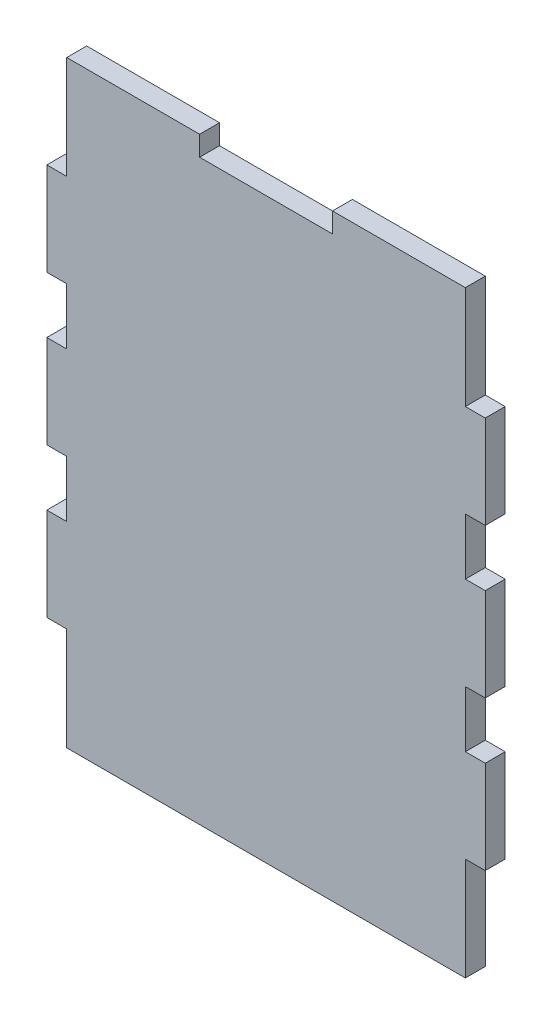
ISO-10303-21;
HEADER;
FILE_DESCRIPTION(('STEP AP214'),'2;1');
FILE_NAME('part.step','',(''),(''),'','','');
FILE_SCHEMA(('AUTOMOTIVE_DESIGN { 1 0 10303 214 1 1 1 1 }'));
ENDSEC;
DATA;
#1=APPLICATION_CONTEXT('core data for automotive mechanical design processes');
#2=APPLICATION_PROTOCOL_DEFINITION('international standard','automotive_design',2000,#1);
#3=PRODUCT_CONTEXT('',#1,'mechanical');
#4=PRODUCT('Part','Part','',(#3));
#5=PRODUCT_RELATED_PRODUCT_CATEGORY('part','',(#4));
#6=PRODUCT_DEFINITION_FORMATION('','',#4);
#7=PRODUCT_DEFINITION_CONTEXT('part definition',#1,'design');
#8=PRODUCT_DEFINITION('design','',#6,#7);
#9=PRODUCT_DEFINITION_SHAPE('','',#8);
#10=(LENGTH_UNIT() NAMED_UNIT(*) SI_UNIT(.MILLI.,.METRE.));
#11=(NAMED_UNIT(*) PLANE_ANGLE_UNIT() SI_UNIT($,.RADIAN.));
#12=(NAMED_UNIT(*) SI_UNIT($,.STERADIAN.) SOLID_ANGLE_UNIT());
#13=UNCERTAINTY_MEASURE_WITH_UNIT(LENGTH_MEASURE(1.E-05),#10,'distance_accuracy_value','');
#14=(GEOMETRIC_REPRESENTATION_CONTEXT(3) GLOBAL_UNCERTAINTY_ASSIGNED_CONTEXT((#13)) GLOBAL_UNIT_ASSIGNED_CONTEXT((#10,
#11,#12)) REPRESENTATION_CONTEXT('',''));
#15=CARTESIAN_POINT('',(0.,0.,0.));
#16=DIRECTION('',(0.,0.,1.));
#17=DIRECTION('',(1.,0.,0.));
#18=AXIS2_PLACEMENT_3D('',#15,#16,#17);
#19=CARTESIAN_POINT('',(0.,45.,3.));
#20=DIRECTION('',(0.,-1.,0.));
#21=DIRECTION('',(0.,0.,-1.));
#22=AXIS2_PLACEMENT_3D('',#19,#20,#21);
#23=PLANE('',#22);
#24=DIRECTION('',(-1.,0.,0.));
#25=VECTOR('',#24,1.);
#26=CARTESIAN_POINT('',(0.,45.,3.));
#27=LINE('',#26,#25);
#28=CARTESIAN_POINT('',(-10.,45.,3.));
#29=VERTEX_POINT('',#28);
#30=CARTESIAN_POINT('',(-30.,45.,3.));
#31=VERTEX_POINT('',#30);
#32=EDGE_CURVE('E1211',#29,#31,#27,.T.);
#33=ORIENTED_EDGE('',*,*,#32,.F.);
#34=DIRECTION('',(0.,0.,-1.));
#35=VECTOR('',#34,1.);
#36=CARTESIAN_POINT('',(-10.,45.,3.));
#37=LINE('',#36,#35);
#38=CARTESIAN_POINT('',(-10.,45.,0.));
#39=VERTEX_POINT('',#38);
#40=EDGE_CURVE('E1217',#29,#39,#37,.T.);
#41=ORIENTED_EDGE('',*,*,#40,.T.);
#42=DIRECTION('',(-1.,0.,0.));
#43=VECTOR('',#42,1.);
#44=CARTESIAN_POINT('',(0.,45.,0.));
#45=LINE('',#44,#43);
#46=CARTESIAN_POINT('',(-30.,45.,0.));
#47=VERTEX_POINT('',#46);
#48=EDGE_CURVE('E1196',#39,#47,#45,.T.);
#49=ORIENTED_EDGE('',*,*,#48,.T.);
#50=DIRECTION('',(0.,0.,-1.));
#51=VECTOR('',#50,1.);
#52=CARTESIAN_POINT('',(-30.,45.,3.));
#53=LINE('',#52,#51);
#54=EDGE_CURVE('E1156',#31,#47,#53,.T.);
#55=ORIENTED_EDGE('',*,*,#54,.F.);
#56=EDGE_LOOP('',(#33,#41,#49,#55));
#57=FACE_BOUND('',#56,.T.);
#58=ADVANCED_FACE('F851',(#57),#23,.F.);
#59=CARTESIAN_POINT('',(-30.,0.,3.));
#60=DIRECTION('',(-1.,0.,0.));
#61=DIRECTION('',(0.,0.,1.));
#62=AXIS2_PLACEMENT_3D('',#59,#60,#61);
#63=PLANE('',#62);
#64=DIRECTION('',(0.,1.,0.));
#65=VECTOR('',#64,1.);
#66=CARTESIAN_POINT('',(-30.,0.,0.));
#67=LINE('',#66,#65);
#68=CARTESIAN_POINT('',(-30.,7.,0.));
#69=VERTEX_POINT('',#68);
#70=CARTESIAN_POINT('',(-30.,15.5,0.));
#71=VERTEX_POINT('',#70);
#72=EDGE_CURVE('E1192',#69,#71,#67,.T.);
#73=ORIENTED_EDGE('',*,*,#72,.F.);
#74=DIRECTION('',(0.,0.,-1.));
#75=VECTOR('',#74,1.);
#76=CARTESIAN_POINT('',(-30.,7.,3.));
#77=LINE('',#76,#75);
#78=CARTESIAN_POINT('',(-30.,7.,3.));
#79=VERTEX_POINT('',#78);
#80=EDGE_CURVE('E1163',#79,#69,#77,.T.);
#81=ORIENTED_EDGE('',*,*,#80,.F.);
#82=DIRECTION('',(0.,1.,0.));
#83=VECTOR('',#82,1.);
#84=CARTESIAN_POINT('',(-30.,0.,3.));
#85=LINE('',#84,#83);
#86=CARTESIAN_POINT('',(-30.,15.5,3.));
#87=VERTEX_POINT('',#86);
#88=EDGE_CURVE('E1207',#79,#87,#85,.T.);
#89=ORIENTED_EDGE('',*,*,#88,.T.);
#90=DIRECTION('',(0.,0.,-1.));
#91=VECTOR('',#90,1.);
#92=CARTESIAN_POINT('',(-30.,15.5,3.));
#93=LINE('',#92,#91);
#94=EDGE_CURVE('E1161',#87,#71,#93,.T.);
#95=ORIENTED_EDGE('',*,*,#94,.T.);
#96=EDGE_LOOP('',(#73,#81,#89,#95));
#97=FACE_BOUND('',#96,.T.);
#98=ADVANCED_FACE('F1362',(#97),#63,.T.);
#99=CARTESIAN_POINT('',(0.,0.,0.));
#100=DIRECTION('',(0.,0.,1.));
#101=DIRECTION('',(1.,0.,0.));
#102=AXIS2_PLACEMENT_3D('',#99,#100,#101);
#103=PLANE('',#102);
#104=ORIENTED_EDGE('',*,*,#48,.F.);
#105=DIRECTION('',(0.,-1.,0.));
#106=VECTOR('',#105,1.);
#107=CARTESIAN_POINT('',(-10.,0.,0.));
#108=LINE('',#107,#106);
#109=CARTESIAN_POINT('',(-10.,42.,0.));
#110=VERTEX_POINT('',#109);
#111=EDGE_CURVE('E1034',#39,#110,#108,.T.);
#112=ORIENTED_EDGE('',*,*,#111,.T.);
#113=DIRECTION('',(1.,0.,0.));
#114=VECTOR('',#113,1.);
#115=CARTESIAN_POINT('',(0.,42.,0.));
#116=LINE('',#115,#114);
#117=CARTESIAN_POINT('',(9.99999999999999,42.,0.));
#118=VERTEX_POINT('',#117);
#119=EDGE_CURVE('E1226',#110,#118,#116,.T.);
#120=ORIENTED_EDGE('',*,*,#119,.T.);
#121=DIRECTION('',(0.,1.,0.));
#122=VECTOR('',#121,1.);
#123=CARTESIAN_POINT('',(9.99999999999999,0.,0.));
#124=LINE('',#123,#122);
#125=CARTESIAN_POINT('',(9.99999999999999,45.,0.));
#126=VERTEX_POINT('',#125);
#127=EDGE_CURVE('E1220',#118,#126,#124,.T.);
#128=ORIENTED_EDGE('',*,*,#127,.T.);
#129=CARTESIAN_POINT('',(30.,45.,0.));
#130=VERTEX_POINT('',#129);
#131=EDGE_CURVE('E1193',#130,#126,#45,.T.);
#132=ORIENTED_EDGE('',*,*,#131,.F.);
#133=DIRECTION('',(0.,1.,0.));
#134=VECTOR('',#133,1.);
#135=CARTESIAN_POINT('',(30.,0.,0.));
#136=LINE('',#135,#134);
#137=CARTESIAN_POINT('',(30.,29.5,0.));
#138=VERTEX_POINT('',#137);
#139=EDGE_CURVE('E1132',#138,#130,#136,.T.);
#140=ORIENTED_EDGE('',*,*,#139,.F.);
#141=DIRECTION('',(-1.,0.,0.));
#142=VECTOR('',#141,1.);
#143=CARTESIAN_POINT('',(0.,29.5,0.));
#144=LINE('',#143,#142);
#145=CARTESIAN_POINT('',(33.,29.5,0.));
#146=VERTEX_POINT('',#145);
#147=EDGE_CURVE('E1095',#146,#138,#144,.T.);
#148=ORIENTED_EDGE('',*,*,#147,.F.);
#149=DIRECTION('',(0.,1.,0.));
#150=VECTOR('',#149,1.);
#151=CARTESIAN_POINT('',(33.,0.,0.));
#152=LINE('',#151,#150);
#153=CARTESIAN_POINT('',(33.,15.5,0.));
#154=VERTEX_POINT('',#153);
#155=EDGE_CURVE('E1071',#154,#146,#152,.T.);
#156=ORIENTED_EDGE('',*,*,#155,.F.);
#157=DIRECTION('',(-1.,0.,0.));
#158=VECTOR('',#157,1.);
#159=CARTESIAN_POINT('',(0.,15.5,0.));
#160=LINE('',#159,#158);
#161=CARTESIAN_POINT('',(30.,15.5,0.));
#162=VERTEX_POINT('',#161);
#163=EDGE_CURVE('E1091',#154,#162,#160,.T.);
#164=ORIENTED_EDGE('',*,*,#163,.T.);
#165=CARTESIAN_POINT('',(30.,7.,0.));
#166=VERTEX_POINT('',#165);
#167=EDGE_CURVE('E1198',#166,#162,#136,.T.);
#168=ORIENTED_EDGE('',*,*,#167,.F.);
#169=DIRECTION('',(-1.,0.,0.));
#170=VECTOR('',#169,1.);
#171=CARTESIAN_POINT('',(0.,6.99999999999999,0.));
#172=LINE('',#171,#170);
#173=CARTESIAN_POINT('',(33.,7.,0.));
#174=VERTEX_POINT('',#173);
#175=EDGE_CURVE('E1117',#174,#166,#172,.T.);
#176=ORIENTED_EDGE('',*,*,#175,.F.);
#177=DIRECTION('',(0.,1.,0.));
#178=VECTOR('',#177,1.);
#179=CARTESIAN_POINT('',(33.,0.,0.));
#180=LINE('',#179,#178);
#181=CARTESIAN_POINT('',(33.,-7.,0.));
#182=VERTEX_POINT('',#181);
#183=EDGE_CURVE('E1087',#182,#174,#180,.T.);
#184=ORIENTED_EDGE('',*,*,#183,.F.);
#185=DIRECTION('',(-1.,0.,0.));
#186=VECTOR('',#185,1.);
#187=CARTESIAN_POINT('',(0.,-7.00000000000001,0.));
#188=LINE('',#187,#186);
#189=CARTESIAN_POINT('',(30.,-7.,0.));
#190=VERTEX_POINT('',#189);
#191=EDGE_CURVE('E1113',#182,#190,#188,.T.);
#192=ORIENTED_EDGE('',*,*,#191,.T.);
#193=CARTESIAN_POINT('',(30.,-15.5,0.));
#194=VERTEX_POINT('',#193);
#195=EDGE_CURVE('E1312',#194,#190,#136,.T.);
#196=ORIENTED_EDGE('',*,*,#195,.F.);
#197=DIRECTION('',(-1.,0.,0.));
#198=VECTOR('',#197,1.);
#199=CARTESIAN_POINT('',(0.,-15.5,0.));
#200=LINE('',#199,#198);
#201=CARTESIAN_POINT('',(33.,-15.5,0.));
#202=VERTEX_POINT('',#201);
#203=EDGE_CURVE('E1140',#202,#194,#200,.T.);
#204=ORIENTED_EDGE('',*,*,#203,.F.);
#205=DIRECTION('',(0.,1.,0.));
#206=VECTOR('',#205,1.);
#207=CARTESIAN_POINT('',(33.,0.,0.));
#208=LINE('',#207,#206);
#209=CARTESIAN_POINT('',(33.,-29.5,0.));
#210=VERTEX_POINT('',#209);
#211=EDGE_CURVE('E1109',#210,#202,#208,.T.);
#212=ORIENTED_EDGE('',*,*,#211,.F.);
#213=DIRECTION('',(-1.,0.,0.));
#214=VECTOR('',#213,1.);
#215=CARTESIAN_POINT('',(0.,-29.5,0.));
#216=LINE('',#215,#214);
#217=CARTESIAN_POINT('',(30.,-29.5,0.));
#218=VERTEX_POINT('',#217);
#219=EDGE_CURVE('E1136',#210,#218,#216,.T.);
#220=ORIENTED_EDGE('',*,*,#219,.T.);
#221=CARTESIAN_POINT('',(30.,-45.,0.));
#222=VERTEX_POINT('',#221);
#223=EDGE_CURVE('E1187',#222,#218,#136,.T.);
#224=ORIENTED_EDGE('',*,*,#223,.F.);
#225=DIRECTION('',(-1.,0.,0.));
#226=VECTOR('',#225,1.);
#227=CARTESIAN_POINT('',(0.,-45.,0.));
#228=LINE('',#227,#226);
#229=CARTESIAN_POINT('',(-30.,-45.,0.));
#230=VERTEX_POINT('',#229);
#231=EDGE_CURVE('E1184',#222,#230,#228,.T.);
#232=ORIENTED_EDGE('',*,*,#231,.T.);
#233=CARTESIAN_POINT('',(-30.,-29.5,0.));
#234=VERTEX_POINT('',#233);
#235=EDGE_CURVE('E1188',#230,#234,#67,.T.);
#236=ORIENTED_EDGE('',*,*,#235,.T.);
#237=DIRECTION('',(-1.,0.,0.));
#238=VECTOR('',#237,1.);
#239=CARTESIAN_POINT('',(-27.,-29.5,0.));
#240=LINE('',#239,#238);
#241=CARTESIAN_POINT('',(-33.,-29.5,0.));
#242=VERTEX_POINT('',#241);
#243=EDGE_CURVE('E1031',#234,#242,#240,.T.);
#244=ORIENTED_EDGE('',*,*,#243,.T.);
#245=DIRECTION('',(0.,1.,0.));
#246=VECTOR('',#245,1.);
#247=CARTESIAN_POINT('',(-33.,-29.5,0.));
#248=LINE('',#247,#246);
#249=CARTESIAN_POINT('',(-33.,-15.5,0.));
#250=VERTEX_POINT('',#249);
#251=EDGE_CURVE('E1016',#242,#250,#248,.T.);
#252=ORIENTED_EDGE('',*,*,#251,.T.);
#253=DIRECTION('',(-1.,0.,0.));
#254=VECTOR('',#253,1.);
#255=CARTESIAN_POINT('',(-27.,-15.5,0.));
#256=LINE('',#255,#254);
#257=CARTESIAN_POINT('',(-30.,-15.5,0.));
#258=VERTEX_POINT('',#257);
#259=EDGE_CURVE('E1003',#258,#250,#256,.T.);
#260=ORIENTED_EDGE('',*,*,#259,.F.);
#261=CARTESIAN_POINT('',(-30.,-7.,0.));
#262=VERTEX_POINT('',#261);
#263=EDGE_CURVE('E1437',#258,#262,#67,.T.);
#264=ORIENTED_EDGE('',*,*,#263,.T.);
#265=DIRECTION('',(-1.,0.,0.));
#266=VECTOR('',#265,1.);
#267=CARTESIAN_POINT('',(-27.,-7.,0.));
#268=LINE('',#267,#266);
#269=CARTESIAN_POINT('',(-33.,-7.,0.));
#270=VERTEX_POINT('',#269);
#271=EDGE_CURVE('E1024',#262,#270,#268,.T.);
#272=ORIENTED_EDGE('',*,*,#271,.T.);
#273=DIRECTION('',(0.,1.,0.));
#274=VECTOR('',#273,1.);
#275=CARTESIAN_POINT('',(-33.,-7.,0.));
#276=LINE('',#275,#274);
#277=CARTESIAN_POINT('',(-33.,7.,0.));
#278=VERTEX_POINT('',#277);
#279=EDGE_CURVE('E1055',#270,#278,#276,.T.);
#280=ORIENTED_EDGE('',*,*,#279,.T.);
#281=DIRECTION('',(-1.,0.,0.));
#282=VECTOR('',#281,1.);
#283=CARTESIAN_POINT('',(-27.,7.,0.));
#284=LINE('',#283,#282);
#285=EDGE_CURVE('E1052',#69,#278,#284,.T.);
#286=ORIENTED_EDGE('',*,*,#285,.F.);
#287=ORIENTED_EDGE('',*,*,#72,.T.);
#288=DIRECTION('',(-1.,0.,0.));
#289=VECTOR('',#288,1.);
#290=CARTESIAN_POINT('',(-27.,15.5,0.));
#291=LINE('',#290,#289);
#292=CARTESIAN_POINT('',(-33.,15.5,0.));
#293=VERTEX_POINT('',#292);
#294=EDGE_CURVE('E1051',#71,#293,#291,.T.);
#295=ORIENTED_EDGE('',*,*,#294,.T.);
#296=DIRECTION('',(0.,1.,0.));
#297=VECTOR('',#296,1.);
#298=CARTESIAN_POINT('',(-33.,15.5,0.));
#299=LINE('',#298,#297);
#300=CARTESIAN_POINT('',(-33.,29.5,0.));
#301=VERTEX_POINT('',#300);
#302=EDGE_CURVE('E1075',#293,#301,#299,.T.);
#303=ORIENTED_EDGE('',*,*,#302,.T.);
#304=DIRECTION('',(-1.,0.,0.));
#305=VECTOR('',#304,1.);
#306=CARTESIAN_POINT('',(-27.,29.5,0.));
#307=LINE('',#306,#305);
#308=CARTESIAN_POINT('',(-30.,29.5,0.));
#309=VERTEX_POINT('',#308);
#310=EDGE_CURVE('E1072',#309,#301,#307,.T.);
#311=ORIENTED_EDGE('',*,*,#310,.F.);
#312=EDGE_CURVE('E1189',#309,#47,#67,.T.);
#313=ORIENTED_EDGE('',*,*,#312,.T.);
#314=EDGE_LOOP('',(#104,#112,#120,#128,#132,#140,#148,#156,#164,#168,#176,#184,#192,#196,#204,
#212,#220,#224,#232,#236,#244,#252,#260,#264,#272,#280,#286,#287,#295,#303,#311,#313));
#315=FACE_BOUND('',#314,.T.);
#316=ADVANCED_FACE('F1028',(#315),#103,.F.);
#317=ORIENTED_EDGE('',*,*,#263,.F.);
#318=DIRECTION('',(0.,0.,-1.));
#319=VECTOR('',#318,1.);
#320=CARTESIAN_POINT('',(-30.,-15.5,3.));
#321=LINE('',#320,#319);
#322=CARTESIAN_POINT('',(-30.,-15.5,3.));
#323=VERTEX_POINT('',#322);
#324=EDGE_CURVE('E1010',#323,#258,#321,.T.);
#325=ORIENTED_EDGE('',*,*,#324,.F.);
#326=CARTESIAN_POINT('',(-30.,-7.,3.));
#327=VERTEX_POINT('',#326);
#328=EDGE_CURVE('E1440',#323,#327,#85,.T.);
#329=ORIENTED_EDGE('',*,*,#328,.T.);
#330=DIRECTION('',(0.,0.,-1.));
#331=VECTOR('',#330,1.);
#332=CARTESIAN_POINT('',(-30.,-7.,3.));
#333=LINE('',#332,#331);
#334=EDGE_CURVE('E1165',#327,#262,#333,.T.);
#335=ORIENTED_EDGE('',*,*,#334,.T.);
#336=EDGE_LOOP('',(#317,#325,#329,#335));
#337=FACE_BOUND('',#336,.T.);
#338=ADVANCED_FACE('F1370',(#337),#63,.T.);
#339=ORIENTED_EDGE('',*,*,#235,.F.);
#340=DIRECTION('',(0.,0.,-1.));
#341=VECTOR('',#340,1.);
#342=CARTESIAN_POINT('',(-30.,-45.,3.));
#343=LINE('',#342,#341);
#344=CARTESIAN_POINT('',(-30.,-45.,3.));
#345=VERTEX_POINT('',#344);
#346=EDGE_CURVE('E1170',#345,#230,#343,.T.);
#347=ORIENTED_EDGE('',*,*,#346,.F.);
#348=CARTESIAN_POINT('',(-30.,-29.5,3.));
#349=VERTEX_POINT('',#348);
#350=EDGE_CURVE('E1203',#345,#349,#85,.T.);
#351=ORIENTED_EDGE('',*,*,#350,.T.);
#352=DIRECTION('',(0.,0.,-1.));
#353=VECTOR('',#352,1.);
#354=CARTESIAN_POINT('',(-30.,-29.5,3.));
#355=LINE('',#354,#353);
#356=EDGE_CURVE('E1168',#349,#234,#355,.T.);
#357=ORIENTED_EDGE('',*,*,#356,.T.);
#358=EDGE_LOOP('',(#339,#347,#351,#357));
#359=FACE_BOUND('',#358,.T.);
#360=ADVANCED_FACE('F1381',(#359),#63,.T.);
#361=CARTESIAN_POINT('',(0.,-45.,3.));
#362=DIRECTION('',(0.,-1.,0.));
#363=DIRECTION('',(0.,0.,-1.));
#364=AXIS2_PLACEMENT_3D('',#361,#362,#363);
#365=PLANE('',#364);
#366=ORIENTED_EDGE('',*,*,#231,.F.);
#367=DIRECTION('',(0.,0.,-1.));
#368=VECTOR('',#367,1.);
#369=CARTESIAN_POINT('',(30.,-45.,3.));
#370=LINE('',#369,#368);
#371=CARTESIAN_POINT('',(30.,-45.,3.));
#372=VERTEX_POINT('',#371);
#373=EDGE_CURVE('E1172',#372,#222,#370,.T.);
#374=ORIENTED_EDGE('',*,*,#373,.F.);
#375=DIRECTION('',(-1.,0.,0.));
#376=VECTOR('',#375,1.);
#377=CARTESIAN_POINT('',(0.,-45.,3.));
#378=LINE('',#377,#376);
#379=EDGE_CURVE('E1199',#372,#345,#378,.T.);
#380=ORIENTED_EDGE('',*,*,#379,.T.);
#381=ORIENTED_EDGE('',*,*,#346,.T.);
#382=EDGE_LOOP('',(#366,#374,#380,#381));
#383=FACE_BOUND('',#382,.T.);
#384=ADVANCED_FACE('F1389',(#383),#365,.T.);
#385=CARTESIAN_POINT('',(30.,0.,3.));
#386=DIRECTION('',(-1.,0.,0.));
#387=DIRECTION('',(0.,0.,1.));
#388=AXIS2_PLACEMENT_3D('',#385,#386,#387);
#389=PLANE('',#388);
#390=ORIENTED_EDGE('',*,*,#223,.T.);
#391=DIRECTION('',(0.,0.,-1.));
#392=VECTOR('',#391,1.);
#393=CARTESIAN_POINT('',(30.,-29.5,3.));
#394=LINE('',#393,#392);
#395=CARTESIAN_POINT('',(30.,-29.5,3.));
#396=VERTEX_POINT('',#395);
#397=EDGE_CURVE('E1174',#396,#218,#394,.T.);
#398=ORIENTED_EDGE('',*,*,#397,.F.);
#399=DIRECTION('',(0.,1.,0.));
#400=VECTOR('',#399,1.);
#401=CARTESIAN_POINT('',(30.,0.,3.));
#402=LINE('',#401,#400);
#403=EDGE_CURVE('E1202',#372,#396,#402,.T.);
#404=ORIENTED_EDGE('',*,*,#403,.F.);
#405=ORIENTED_EDGE('',*,*,#373,.T.);
#406=EDGE_LOOP('',(#390,#398,#404,#405));
#407=FACE_BOUND('',#406,.T.);
#408=ADVANCED_FACE('F1326',(#407),#389,.F.);
#409=ORIENTED_EDGE('',*,*,#195,.T.);
#410=DIRECTION('',(0.,0.,-1.));
#411=VECTOR('',#410,1.);
#412=CARTESIAN_POINT('',(30.,-7.,3.));
#413=LINE('',#412,#411);
#414=CARTESIAN_POINT('',(30.,-7.,3.));
#415=VERTEX_POINT('',#414);
#416=EDGE_CURVE('E1178',#415,#190,#413,.T.);
#417=ORIENTED_EDGE('',*,*,#416,.F.);
#418=CARTESIAN_POINT('',(30.,-15.5,3.));
#419=VERTEX_POINT('',#418);
#420=EDGE_CURVE('E1310',#419,#415,#402,.T.);
#421=ORIENTED_EDGE('',*,*,#420,.F.);
#422=DIRECTION('',(0.,0.,-1.));
#423=VECTOR('',#422,1.);
#424=CARTESIAN_POINT('',(30.,-15.5,3.));
#425=LINE('',#424,#423);
#426=EDGE_CURVE('E1176',#419,#194,#425,.T.);
#427=ORIENTED_EDGE('',*,*,#426,.T.);
#428=EDGE_LOOP('',(#409,#417,#421,#427));
#429=FACE_BOUND('',#428,.T.);
#430=ADVANCED_FACE('F1308',(#429),#389,.F.);
#431=ORIENTED_EDGE('',*,*,#167,.T.);
#432=DIRECTION('',(0.,0.,-1.));
#433=VECTOR('',#432,1.);
#434=CARTESIAN_POINT('',(30.,15.5,3.));
#435=LINE('',#434,#433);
#436=CARTESIAN_POINT('',(30.,15.5,3.));
#437=VERTEX_POINT('',#436);
#438=EDGE_CURVE('E874',#437,#162,#435,.T.);
#439=ORIENTED_EDGE('',*,*,#438,.F.);
#440=CARTESIAN_POINT('',(30.,7.,3.));
#441=VERTEX_POINT('',#440);
#442=EDGE_CURVE('E1183',#441,#437,#402,.T.);
#443=ORIENTED_EDGE('',*,*,#442,.F.);
#444=DIRECTION('',(0.,0.,-1.));
#445=VECTOR('',#444,1.);
#446=CARTESIAN_POINT('',(30.,7.,3.));
#447=LINE('',#446,#445);
#448=EDGE_CURVE('E1180',#441,#166,#447,.T.);
#449=ORIENTED_EDGE('',*,*,#448,.T.);
#450=EDGE_LOOP('',(#431,#439,#443,#449));
#451=FACE_BOUND('',#450,.T.);
#452=ADVANCED_FACE('F1340',(#451),#389,.F.);
#453=ORIENTED_EDGE('',*,*,#139,.T.);
#454=DIRECTION('',(0.,0.,-1.));
#455=VECTOR('',#454,1.);
#456=CARTESIAN_POINT('',(30.,45.,3.));
#457=LINE('',#456,#455);
#458=CARTESIAN_POINT('',(30.,45.,3.));
#459=VERTEX_POINT('',#458);
#460=EDGE_CURVE('E1153',#459,#130,#457,.T.);
#461=ORIENTED_EDGE('',*,*,#460,.F.);
#462=CARTESIAN_POINT('',(30.,29.5,3.));
#463=VERTEX_POINT('',#462);
#464=EDGE_CURVE('E1212',#463,#459,#402,.T.);
#465=ORIENTED_EDGE('',*,*,#464,.F.);
#466=DIRECTION('',(0.,0.,-1.));
#467=VECTOR('',#466,1.);
#468=CARTESIAN_POINT('',(30.,29.5,3.));
#469=LINE('',#468,#467);
#470=EDGE_CURVE('E859',#463,#138,#469,.T.);
#471=ORIENTED_EDGE('',*,*,#470,.T.);
#472=EDGE_LOOP('',(#453,#461,#465,#471));
#473=FACE_BOUND('',#472,.T.);
#474=ADVANCED_FACE('F1375',(#473),#389,.F.);
#475=ORIENTED_EDGE('',*,*,#131,.T.);
#476=DIRECTION('',(0.,0.,1.));
#477=VECTOR('',#476,1.);
#478=CARTESIAN_POINT('',(9.99999999999999,45.,3.));
#479=LINE('',#478,#477);
#480=CARTESIAN_POINT('',(9.99999999999999,45.,3.));
#481=VERTEX_POINT('',#480);
#482=EDGE_CURVE('E1223',#126,#481,#479,.T.);
#483=ORIENTED_EDGE('',*,*,#482,.T.);
#484=EDGE_CURVE('E1208',#459,#481,#27,.T.);
#485=ORIENTED_EDGE('',*,*,#484,.F.);
#486=ORIENTED_EDGE('',*,*,#460,.T.);
#487=EDGE_LOOP('',(#475,#483,#485,#486));
#488=FACE_BOUND('',#487,.T.);
#489=ADVANCED_FACE('F1256',(#488),#23,.F.);
#490=ORIENTED_EDGE('',*,*,#312,.F.);
#491=DIRECTION('',(0.,0.,-1.));
#492=VECTOR('',#491,1.);
#493=CARTESIAN_POINT('',(-30.,29.5,3.));
#494=LINE('',#493,#492);
#495=CARTESIAN_POINT('',(-30.,29.5,3.));
#496=VERTEX_POINT('',#495);
#497=EDGE_CURVE('E1159',#496,#309,#494,.T.);
#498=ORIENTED_EDGE('',*,*,#497,.F.);
#499=EDGE_CURVE('E1204',#496,#31,#85,.T.);
#500=ORIENTED_EDGE('',*,*,#499,.T.);
#501=ORIENTED_EDGE('',*,*,#54,.T.);
#502=EDGE_LOOP('',(#490,#498,#500,#501));
#503=FACE_BOUND('',#502,.T.);
#504=ADVANCED_FACE('F1371',(#503),#63,.T.);
#505=CARTESIAN_POINT('',(0.,0.,3.));
#506=DIRECTION('',(0.,0.,1.));
#507=DIRECTION('',(1.,0.,0.));
#508=AXIS2_PLACEMENT_3D('',#505,#506,#507);
#509=PLANE('',#508);
#510=DIRECTION('',(0.,-1.,0.));
#511=VECTOR('',#510,1.);
#512=CARTESIAN_POINT('',(-10.,0.,3.));
#513=LINE('',#512,#511);
#514=CARTESIAN_POINT('',(-10.,42.,3.));
#515=VERTEX_POINT('',#514);
#516=EDGE_CURVE('E12',#29,#515,#513,.T.);
#517=ORIENTED_EDGE('',*,*,#516,.F.);
#518=ORIENTED_EDGE('',*,*,#32,.T.);
#519=ORIENTED_EDGE('',*,*,#499,.F.);
#520=DIRECTION('',(-1.,0.,0.));
#521=VECTOR('',#520,1.);
#522=CARTESIAN_POINT('',(-27.,29.5,3.));
#523=LINE('',#522,#521);
#524=CARTESIAN_POINT('',(-33.,29.5,3.));
#525=VERTEX_POINT('',#524);
#526=EDGE_CURVE('E1068',#496,#525,#523,.T.);
#527=ORIENTED_EDGE('',*,*,#526,.T.);
#528=DIRECTION('',(0.,1.,0.));
#529=VECTOR('',#528,1.);
#530=CARTESIAN_POINT('',(-33.,15.5,3.));
#531=LINE('',#530,#529);
#532=CARTESIAN_POINT('',(-33.,15.5,3.));
#533=VERTEX_POINT('',#532);
#534=EDGE_CURVE('E1080',#533,#525,#531,.T.);
#535=ORIENTED_EDGE('',*,*,#534,.F.);
#536=DIRECTION('',(-1.,0.,0.));
#537=VECTOR('',#536,1.);
#538=CARTESIAN_POINT('',(-27.,15.5,3.));
#539=LINE('',#538,#537);
#540=EDGE_CURVE('E1074',#87,#533,#539,.T.);
#541=ORIENTED_EDGE('',*,*,#540,.F.);
#542=ORIENTED_EDGE('',*,*,#88,.F.);
#543=DIRECTION('',(-1.,0.,0.));
#544=VECTOR('',#543,1.);
#545=CARTESIAN_POINT('',(-27.,7.,3.));
#546=LINE('',#545,#544);
#547=CARTESIAN_POINT('',(-33.,7.,3.));
#548=VERTEX_POINT('',#547);
#549=EDGE_CURVE('E1048',#79,#548,#546,.T.);
#550=ORIENTED_EDGE('',*,*,#549,.T.);
#551=DIRECTION('',(0.,1.,0.));
#552=VECTOR('',#551,1.);
#553=CARTESIAN_POINT('',(-33.,-7.,3.));
#554=LINE('',#553,#552);
#555=CARTESIAN_POINT('',(-33.,-7.,3.));
#556=VERTEX_POINT('',#555);
#557=EDGE_CURVE('E1060',#556,#548,#554,.T.);
#558=ORIENTED_EDGE('',*,*,#557,.F.);
#559=DIRECTION('',(-1.,0.,0.));
#560=VECTOR('',#559,1.);
#561=CARTESIAN_POINT('',(-27.,-7.,3.));
#562=LINE('',#561,#560);
#563=EDGE_CURVE('E1054',#327,#556,#562,.T.);
#564=ORIENTED_EDGE('',*,*,#563,.F.);
#565=ORIENTED_EDGE('',*,*,#328,.F.);
#566=DIRECTION('',(-1.,0.,0.));
#567=VECTOR('',#566,1.);
#568=CARTESIAN_POINT('',(-27.,-15.5,3.));
#569=LINE('',#568,#567);
#570=CARTESIAN_POINT('',(-33.,-15.5,3.));
#571=VERTEX_POINT('',#570);
#572=EDGE_CURVE('E1037',#323,#571,#569,.T.);
#573=ORIENTED_EDGE('',*,*,#572,.T.);
#574=DIRECTION('',(0.,1.,0.));
#575=VECTOR('',#574,1.);
#576=CARTESIAN_POINT('',(-33.,-29.5,3.));
#577=LINE('',#576,#575);
#578=CARTESIAN_POINT('',(-33.,-29.5,3.));
#579=VERTEX_POINT('',#578);
#580=EDGE_CURVE('E1023',#579,#571,#577,.T.);
#581=ORIENTED_EDGE('',*,*,#580,.F.);
#582=DIRECTION('',(-1.,0.,0.));
#583=VECTOR('',#582,1.);
#584=CARTESIAN_POINT('',(-27.,-29.5,3.));
#585=LINE('',#584,#583);
#586=EDGE_CURVE('E1015',#349,#579,#585,.T.);
#587=ORIENTED_EDGE('',*,*,#586,.F.);
#588=ORIENTED_EDGE('',*,*,#350,.F.);
#589=ORIENTED_EDGE('',*,*,#379,.F.);
#590=ORIENTED_EDGE('',*,*,#403,.T.);
#591=DIRECTION('',(-1.,0.,0.));
#592=VECTOR('',#591,1.);
#593=CARTESIAN_POINT('',(0.,-29.5,3.));
#594=LINE('',#593,#592);
#595=CARTESIAN_POINT('',(33.,-29.5,3.));
#596=VERTEX_POINT('',#595);
#597=EDGE_CURVE('E1135',#596,#396,#594,.T.);
#598=ORIENTED_EDGE('',*,*,#597,.F.);
#599=DIRECTION('',(0.,1.,0.));
#600=VECTOR('',#599,1.);
#601=CARTESIAN_POINT('',(33.,0.,3.));
#602=LINE('',#601,#600);
#603=CARTESIAN_POINT('',(33.,-15.5,3.));
#604=VERTEX_POINT('',#603);
#605=EDGE_CURVE('E1139',#596,#604,#602,.T.);
#606=ORIENTED_EDGE('',*,*,#605,.T.);
#607=DIRECTION('',(-1.,0.,0.));
#608=VECTOR('',#607,1.);
#609=CARTESIAN_POINT('',(0.,-15.5,3.));
#610=LINE('',#609,#608);
#611=EDGE_CURVE('E1147',#604,#419,#610,.T.);
#612=ORIENTED_EDGE('',*,*,#611,.T.);
#613=ORIENTED_EDGE('',*,*,#420,.T.);
#614=DIRECTION('',(-1.,0.,0.));
#615=VECTOR('',#614,1.);
#616=CARTESIAN_POINT('',(0.,-7.00000000000001,3.));
#617=LINE('',#616,#615);
#618=CARTESIAN_POINT('',(33.,-7.,3.));
#619=VERTEX_POINT('',#618);
#620=EDGE_CURVE('E1112',#619,#415,#617,.T.);
#621=ORIENTED_EDGE('',*,*,#620,.F.);
#622=DIRECTION('',(0.,1.,0.));
#623=VECTOR('',#622,1.);
#624=CARTESIAN_POINT('',(33.,0.,3.));
#625=LINE('',#624,#623);
#626=CARTESIAN_POINT('',(33.,7.,3.));
#627=VERTEX_POINT('',#626);
#628=EDGE_CURVE('E1116',#619,#627,#625,.T.);
#629=ORIENTED_EDGE('',*,*,#628,.T.);
#630=DIRECTION('',(-1.,0.,0.));
#631=VECTOR('',#630,1.);
#632=CARTESIAN_POINT('',(0.,6.99999999999999,3.));
#633=LINE('',#632,#631);
#634=EDGE_CURVE('E1124',#627,#441,#633,.T.);
#635=ORIENTED_EDGE('',*,*,#634,.T.);
#636=ORIENTED_EDGE('',*,*,#442,.T.);
#637=DIRECTION('',(-1.,0.,0.));
#638=VECTOR('',#637,1.);
#639=CARTESIAN_POINT('',(0.,15.5,3.));
#640=LINE('',#639,#638);
#641=CARTESIAN_POINT('',(33.,15.5,3.));
#642=VERTEX_POINT('',#641);
#643=EDGE_CURVE('E1090',#642,#437,#640,.T.);
#644=ORIENTED_EDGE('',*,*,#643,.F.);
#645=DIRECTION('',(0.,1.,0.));
#646=VECTOR('',#645,1.);
#647=CARTESIAN_POINT('',(33.,0.,3.));
#648=LINE('',#647,#646);
#649=CARTESIAN_POINT('',(33.,29.5,3.));
#650=VERTEX_POINT('',#649);
#651=EDGE_CURVE('E1094',#642,#650,#648,.T.);
#652=ORIENTED_EDGE('',*,*,#651,.T.);
#653=DIRECTION('',(-1.,0.,0.));
#654=VECTOR('',#653,1.);
#655=CARTESIAN_POINT('',(0.,29.5,3.));
#656=LINE('',#655,#654);
#657=EDGE_CURVE('E1101',#650,#463,#656,.T.);
#658=ORIENTED_EDGE('',*,*,#657,.T.);
#659=ORIENTED_EDGE('',*,*,#464,.T.);
#660=ORIENTED_EDGE('',*,*,#484,.T.);
#661=DIRECTION('',(0.,1.,0.));
#662=VECTOR('',#661,1.);
#663=CARTESIAN_POINT('',(9.99999999999999,42.,3.));
#664=LINE('',#663,#662);
#665=CARTESIAN_POINT('',(9.99999999999999,42.,3.));
#666=VERTEX_POINT('',#665);
#667=EDGE_CURVE('E1231',#666,#481,#664,.T.);
#668=ORIENTED_EDGE('',*,*,#667,.F.);
#669=DIRECTION('',(1.,0.,0.));
#670=VECTOR('',#669,1.);
#671=CARTESIAN_POINT('',(9.99999999999999,42.,3.));
#672=LINE('',#671,#670);
#673=EDGE_CURVE('E1236',#515,#666,#672,.T.);
#674=ORIENTED_EDGE('',*,*,#673,.F.);
#675=EDGE_LOOP('',(#517,#518,#519,#527,#535,#541,#542,#550,#558,#564,#565,#573,#581,#587,#588,
#589,#590,#598,#606,#612,#613,#621,#629,#635,#636,#644,#652,#658,#659,#660,#668,#674));
#676=FACE_BOUND('',#675,.T.);
#677=ADVANCED_FACE('F1246',(#676),#509,.T.);
#678=CARTESIAN_POINT('',(-33.,-7.,3.));
#679=DIRECTION('',(-1.,0.,0.));
#680=DIRECTION('',(0.,0.,1.));
#681=AXIS2_PLACEMENT_3D('',#678,#679,#680);
#682=PLANE('',#681);
#683=ORIENTED_EDGE('',*,*,#279,.F.);
#684=DIRECTION('',(0.,0.,-1.));
#685=VECTOR('',#684,1.);
#686=CARTESIAN_POINT('',(-33.,-7.,3.));
#687=LINE('',#686,#685);
#688=EDGE_CURVE('E1044',#556,#270,#687,.T.);
#689=ORIENTED_EDGE('',*,*,#688,.F.);
#690=ORIENTED_EDGE('',*,*,#557,.T.);
#691=DIRECTION('',(0.,0.,-1.));
#692=VECTOR('',#691,1.);
#693=CARTESIAN_POINT('',(-33.,7.,3.));
#694=LINE('',#693,#692);
#695=EDGE_CURVE('E1047',#548,#278,#694,.T.);
#696=ORIENTED_EDGE('',*,*,#695,.T.);
#697=EDGE_LOOP('',(#683,#689,#690,#696));
#698=FACE_BOUND('',#697,.T.);
#699=ADVANCED_FACE('F1372',(#698),#682,.T.);
#700=CARTESIAN_POINT('',(-27.,-7.,3.));
#701=DIRECTION('',(0.,-1.,0.));
#702=DIRECTION('',(1.,0.,0.));
#703=AXIS2_PLACEMENT_3D('',#700,#701,#702);
#704=PLANE('',#703);
#705=ORIENTED_EDGE('',*,*,#271,.F.);
#706=ORIENTED_EDGE('',*,*,#334,.F.);
#707=ORIENTED_EDGE('',*,*,#563,.T.);
#708=ORIENTED_EDGE('',*,*,#688,.T.);
#709=EDGE_LOOP('',(#705,#706,#707,#708));
#710=FACE_BOUND('',#709,.T.);
#711=ADVANCED_FACE('F1410',(#710),#704,.T.);
#712=CARTESIAN_POINT('',(-27.,7.,3.));
#713=DIRECTION('',(0.,-1.,0.));
#714=DIRECTION('',(1.,0.,0.));
#715=AXIS2_PLACEMENT_3D('',#712,#713,#714);
#716=PLANE('',#715);
#717=ORIENTED_EDGE('',*,*,#80,.T.);
#718=ORIENTED_EDGE('',*,*,#285,.T.);
#719=ORIENTED_EDGE('',*,*,#695,.F.);
#720=ORIENTED_EDGE('',*,*,#549,.F.);
#721=EDGE_LOOP('',(#717,#718,#719,#720));
#722=FACE_BOUND('',#721,.T.);
#723=ADVANCED_FACE('F1383',(#722),#716,.F.);
#724=CARTESIAN_POINT('',(-33.,-29.5,3.));
#725=DIRECTION('',(-1.,0.,0.));
#726=DIRECTION('',(0.,0.,1.));
#727=AXIS2_PLACEMENT_3D('',#724,#725,#726);
#728=PLANE('',#727);
#729=ORIENTED_EDGE('',*,*,#251,.F.);
#730=DIRECTION('',(0.,0.,-1.));
#731=VECTOR('',#730,1.);
#732=CARTESIAN_POINT('',(-33.,-29.5,3.));
#733=LINE('',#732,#731);
#734=EDGE_CURVE('E1025',#579,#242,#733,.T.);
#735=ORIENTED_EDGE('',*,*,#734,.F.);
#736=ORIENTED_EDGE('',*,*,#580,.T.);
#737=DIRECTION('',(0.,0.,-1.));
#738=VECTOR('',#737,1.);
#739=CARTESIAN_POINT('',(-33.,-15.5,3.));
#740=LINE('',#739,#738);
#741=EDGE_CURVE('E1007',#571,#250,#740,.T.);
#742=ORIENTED_EDGE('',*,*,#741,.T.);
#743=EDGE_LOOP('',(#729,#735,#736,#742));
#744=FACE_BOUND('',#743,.T.);
#745=ADVANCED_FACE('F1020',(#744),#728,.T.);
#746=CARTESIAN_POINT('',(-27.,-29.5,3.));
#747=DIRECTION('',(0.,-1.,0.));
#748=DIRECTION('',(0.,0.,-1.));
#749=AXIS2_PLACEMENT_3D('',#746,#747,#748);
#750=PLANE('',#749);
#751=ORIENTED_EDGE('',*,*,#243,.F.);
#752=ORIENTED_EDGE('',*,*,#356,.F.);
#753=ORIENTED_EDGE('',*,*,#586,.T.);
#754=ORIENTED_EDGE('',*,*,#734,.T.);
#755=EDGE_LOOP('',(#751,#752,#753,#754));
#756=FACE_BOUND('',#755,.T.);
#757=ADVANCED_FACE('F853',(#756),#750,.T.);
#758=CARTESIAN_POINT('',(-27.,-15.5,3.));
#759=DIRECTION('',(0.,-1.,0.));
#760=DIRECTION('',(0.,0.,-1.));
#761=AXIS2_PLACEMENT_3D('',#758,#759,#760);
#762=PLANE('',#761);
#763=ORIENTED_EDGE('',*,*,#324,.T.);
#764=ORIENTED_EDGE('',*,*,#259,.T.);
#765=ORIENTED_EDGE('',*,*,#741,.F.);
#766=ORIENTED_EDGE('',*,*,#572,.F.);
#767=EDGE_LOOP('',(#763,#764,#765,#766));
#768=FACE_BOUND('',#767,.T.);
#769=ADVANCED_FACE('F1005',(#768),#762,.F.);
#770=CARTESIAN_POINT('',(-33.,15.5,3.));
#771=DIRECTION('',(-1.,0.,0.));
#772=DIRECTION('',(0.,0.,1.));
#773=AXIS2_PLACEMENT_3D('',#770,#771,#772);
#774=PLANE('',#773);
#775=ORIENTED_EDGE('',*,*,#302,.F.);
#776=DIRECTION('',(0.,0.,-1.));
#777=VECTOR('',#776,1.);
#778=CARTESIAN_POINT('',(-33.,15.5,3.));
#779=LINE('',#778,#777);
#780=EDGE_CURVE('E1064',#533,#293,#779,.T.);
#781=ORIENTED_EDGE('',*,*,#780,.F.);
#782=ORIENTED_EDGE('',*,*,#534,.T.);
#783=DIRECTION('',(0.,0.,-1.));
#784=VECTOR('',#783,1.);
#785=CARTESIAN_POINT('',(-33.,29.5,3.));
#786=LINE('',#785,#784);
#787=EDGE_CURVE('E1067',#525,#301,#786,.T.);
#788=ORIENTED_EDGE('',*,*,#787,.T.);
#789=EDGE_LOOP('',(#775,#781,#782,#788));
#790=FACE_BOUND('',#789,.T.);
#791=ADVANCED_FACE('F1399',(#790),#774,.T.);
#792=CARTESIAN_POINT('',(-27.,15.5,3.));
#793=DIRECTION('',(0.,-1.,0.));
#794=DIRECTION('',(0.,0.,-1.));
#795=AXIS2_PLACEMENT_3D('',#792,#793,#794);
#796=PLANE('',#795);
#797=ORIENTED_EDGE('',*,*,#294,.F.);
#798=ORIENTED_EDGE('',*,*,#94,.F.);
#799=ORIENTED_EDGE('',*,*,#540,.T.);
#800=ORIENTED_EDGE('',*,*,#780,.T.);
#801=EDGE_LOOP('',(#797,#798,#799,#800));
#802=FACE_BOUND('',#801,.T.);
#803=ADVANCED_FACE('F1406',(#802),#796,.T.);
#804=CARTESIAN_POINT('',(-27.,29.5,3.));
#805=DIRECTION('',(0.,-1.,0.));
#806=DIRECTION('',(0.,0.,-1.));
#807=AXIS2_PLACEMENT_3D('',#804,#805,#806);
#808=PLANE('',#807);
#809=ORIENTED_EDGE('',*,*,#497,.T.);
#810=ORIENTED_EDGE('',*,*,#310,.T.);
#811=ORIENTED_EDGE('',*,*,#787,.F.);
#812=ORIENTED_EDGE('',*,*,#526,.F.);
#813=EDGE_LOOP('',(#809,#810,#811,#812));
#814=FACE_BOUND('',#813,.T.);
#815=ADVANCED_FACE('F1461',(#814),#808,.F.);
#816=CARTESIAN_POINT('',(33.,0.,3.));
#817=DIRECTION('',(-1.,0.,0.));
#818=DIRECTION('',(0.,0.,1.));
#819=AXIS2_PLACEMENT_3D('',#816,#817,#818);
#820=PLANE('',#819);
#821=ORIENTED_EDGE('',*,*,#155,.T.);
#822=DIRECTION('',(0.,0.,-1.));
#823=VECTOR('',#822,1.);
#824=CARTESIAN_POINT('',(33.,29.5,3.));
#825=LINE('',#824,#823);
#826=EDGE_CURVE('E1084',#650,#146,#825,.T.);
#827=ORIENTED_EDGE('',*,*,#826,.F.);
#828=ORIENTED_EDGE('',*,*,#651,.F.);
#829=DIRECTION('',(0.,0.,-1.));
#830=VECTOR('',#829,1.);
#831=CARTESIAN_POINT('',(33.,15.5,3.));
#832=LINE('',#831,#830);
#833=EDGE_CURVE('E1088',#642,#154,#832,.T.);
#834=ORIENTED_EDGE('',*,*,#833,.T.);
#835=EDGE_LOOP('',(#821,#827,#828,#834));
#836=FACE_BOUND('',#835,.T.);
#837=ADVANCED_FACE('F1463',(#836),#820,.F.);
#838=CARTESIAN_POINT('',(0.,15.5,3.));
#839=DIRECTION('',(0.,-1.,0.));
#840=DIRECTION('',(0.,0.,-1.));
#841=AXIS2_PLACEMENT_3D('',#838,#839,#840);
#842=PLANE('',#841);
#843=ORIENTED_EDGE('',*,*,#163,.F.);
#844=ORIENTED_EDGE('',*,*,#833,.F.);
#845=ORIENTED_EDGE('',*,*,#643,.T.);
#846=ORIENTED_EDGE('',*,*,#438,.T.);
#847=EDGE_LOOP('',(#843,#844,#845,#846));
#848=FACE_BOUND('',#847,.T.);
#849=ADVANCED_FACE('F1344',(#848),#842,.T.);
#850=CARTESIAN_POINT('',(0.,29.5,3.));
#851=DIRECTION('',(0.,-1.,0.));
#852=DIRECTION('',(0.,0.,-1.));
#853=AXIS2_PLACEMENT_3D('',#850,#851,#852);
#854=PLANE('',#853);
#855=ORIENTED_EDGE('',*,*,#147,.T.);
#856=ORIENTED_EDGE('',*,*,#470,.F.);
#857=ORIENTED_EDGE('',*,*,#657,.F.);
#858=ORIENTED_EDGE('',*,*,#826,.T.);
#859=EDGE_LOOP('',(#855,#856,#857,#858));
#860=FACE_BOUND('',#859,.T.);
#861=ADVANCED_FACE('F1472',(#860),#854,.F.);
#862=CARTESIAN_POINT('',(33.,0.,3.));
#863=DIRECTION('',(-1.,0.,0.));
#864=DIRECTION('',(0.,0.,1.));
#865=AXIS2_PLACEMENT_3D('',#862,#863,#864);
#866=PLANE('',#865);
#867=ORIENTED_EDGE('',*,*,#211,.T.);
#868=DIRECTION('',(0.,0.,-1.));
#869=VECTOR('',#868,1.);
#870=CARTESIAN_POINT('',(33.,-15.5,3.));
#871=LINE('',#870,#869);
#872=EDGE_CURVE('E1129',#604,#202,#871,.T.);
#873=ORIENTED_EDGE('',*,*,#872,.F.);
#874=ORIENTED_EDGE('',*,*,#605,.F.);
#875=DIRECTION('',(0.,0.,-1.));
#876=VECTOR('',#875,1.);
#877=CARTESIAN_POINT('',(33.,-29.5,3.));
#878=LINE('',#877,#876);
#879=EDGE_CURVE('E1133',#596,#210,#878,.T.);
#880=ORIENTED_EDGE('',*,*,#879,.T.);
#881=EDGE_LOOP('',(#867,#873,#874,#880));
#882=FACE_BOUND('',#881,.T.);
#883=ADVANCED_FACE('F1335',(#882),#866,.F.);
#884=CARTESIAN_POINT('',(0.,-15.5,3.));
#885=DIRECTION('',(0.,-1.,0.));
#886=DIRECTION('',(0.,0.,-1.));
#887=AXIS2_PLACEMENT_3D('',#884,#885,#886);
#888=PLANE('',#887);
#889=ORIENTED_EDGE('',*,*,#203,.T.);
#890=ORIENTED_EDGE('',*,*,#426,.F.);
#891=ORIENTED_EDGE('',*,*,#611,.F.);
#892=ORIENTED_EDGE('',*,*,#872,.T.);
#893=EDGE_LOOP('',(#889,#890,#891,#892));
#894=FACE_BOUND('',#893,.T.);
#895=ADVANCED_FACE('F1337',(#894),#888,.F.);
#896=CARTESIAN_POINT('',(0.,-29.5,3.));
#897=DIRECTION('',(0.,-1.,0.));
#898=DIRECTION('',(0.,0.,-1.));
#899=AXIS2_PLACEMENT_3D('',#896,#897,#898);
#900=PLANE('',#899);
#901=ORIENTED_EDGE('',*,*,#219,.F.);
#902=ORIENTED_EDGE('',*,*,#879,.F.);
#903=ORIENTED_EDGE('',*,*,#597,.T.);
#904=ORIENTED_EDGE('',*,*,#397,.T.);
#905=EDGE_LOOP('',(#901,#902,#903,#904));
#906=FACE_BOUND('',#905,.T.);
#907=ADVANCED_FACE('F1330',(#906),#900,.T.);
#908=CARTESIAN_POINT('',(33.,0.,3.));
#909=DIRECTION('',(-1.,0.,0.));
#910=DIRECTION('',(0.,0.,1.));
#911=AXIS2_PLACEMENT_3D('',#908,#909,#910);
#912=PLANE('',#911);
#913=ORIENTED_EDGE('',*,*,#183,.T.);
#914=DIRECTION('',(0.,0.,-1.));
#915=VECTOR('',#914,1.);
#916=CARTESIAN_POINT('',(33.,7.,3.));
#917=LINE('',#916,#915);
#918=EDGE_CURVE('E1106',#627,#174,#917,.T.);
#919=ORIENTED_EDGE('',*,*,#918,.F.);
#920=ORIENTED_EDGE('',*,*,#628,.F.);
#921=DIRECTION('',(0.,0.,-1.));
#922=VECTOR('',#921,1.);
#923=CARTESIAN_POINT('',(33.,-7.,3.));
#924=LINE('',#923,#922);
#925=EDGE_CURVE('E1110',#619,#182,#924,.T.);
#926=ORIENTED_EDGE('',*,*,#925,.T.);
#927=EDGE_LOOP('',(#913,#919,#920,#926));
#928=FACE_BOUND('',#927,.T.);
#929=ADVANCED_FACE('F1351',(#928),#912,.F.);
#930=CARTESIAN_POINT('',(0.,6.99999999999999,3.));
#931=DIRECTION('',(0.,-1.,0.));
#932=DIRECTION('',(1.,0.,0.));
#933=AXIS2_PLACEMENT_3D('',#930,#931,#932);
#934=PLANE('',#933);
#935=ORIENTED_EDGE('',*,*,#175,.T.);
#936=ORIENTED_EDGE('',*,*,#448,.F.);
#937=ORIENTED_EDGE('',*,*,#634,.F.);
#938=ORIENTED_EDGE('',*,*,#918,.T.);
#939=EDGE_LOOP('',(#935,#936,#937,#938));
#940=FACE_BOUND('',#939,.T.);
#941=ADVANCED_FACE('F1349',(#940),#934,.F.);
#942=CARTESIAN_POINT('',(0.,-7.00000000000001,3.));
#943=DIRECTION('',(0.,-1.,0.));
#944=DIRECTION('',(1.,0.,0.));
#945=AXIS2_PLACEMENT_3D('',#942,#943,#944);
#946=PLANE('',#945);
#947=ORIENTED_EDGE('',*,*,#191,.F.);
#948=ORIENTED_EDGE('',*,*,#925,.F.);
#949=ORIENTED_EDGE('',*,*,#620,.T.);
#950=ORIENTED_EDGE('',*,*,#416,.T.);
#951=EDGE_LOOP('',(#947,#948,#949,#950));
#952=FACE_BOUND('',#951,.T.);
#953=ADVANCED_FACE('F1316',(#952),#946,.T.);
#954=CARTESIAN_POINT('',(-10.,42.,-7.));
#955=DIRECTION('',(-1.,0.,0.));
#956=DIRECTION('',(0.,0.,1.));
#957=AXIS2_PLACEMENT_3D('',#954,#955,#956);
#958=PLANE('',#957);
#959=ORIENTED_EDGE('',*,*,#40,.F.);
#960=ORIENTED_EDGE('',*,*,#516,.T.);
#961=DIRECTION('',(0.,0.,1.));
#962=VECTOR('',#961,1.);
#963=CARTESIAN_POINT('',(-10.,42.,-7.));
#964=LINE('',#963,#962);
#965=EDGE_CURVE('E866',#110,#515,#964,.T.);
#966=ORIENTED_EDGE('',*,*,#965,.F.);
#967=ORIENTED_EDGE('',*,*,#111,.F.);
#968=EDGE_LOOP('',(#959,#960,#966,#967));
#969=FACE_BOUND('',#968,.T.);
#970=ADVANCED_FACE('F1428',(#969),#958,.F.);
#971=CARTESIAN_POINT('',(9.99999999999999,42.,-7.));
#972=DIRECTION('',(1.,0.,0.));
#973=DIRECTION('',(0.,0.,-1.));
#974=AXIS2_PLACEMENT_3D('',#971,#972,#973);
#975=PLANE('',#974);
#976=DIRECTION('',(0.,0.,1.));
#977=VECTOR('',#976,1.);
#978=CARTESIAN_POINT('',(9.99999999999999,42.,-7.));
#979=LINE('',#978,#977);
#980=EDGE_CURVE('E1229',#118,#666,#979,.T.);
#981=ORIENTED_EDGE('',*,*,#980,.T.);
#982=ORIENTED_EDGE('',*,*,#667,.T.);
#983=ORIENTED_EDGE('',*,*,#482,.F.);
#984=ORIENTED_EDGE('',*,*,#127,.F.);
#985=EDGE_LOOP('',(#981,#982,#983,#984));
#986=FACE_BOUND('',#985,.T.);
#987=ADVANCED_FACE('F1251',(#986),#975,.F.);
#988=CARTESIAN_POINT('',(9.99999999999999,42.,-7.));
#989=DIRECTION('',(0.,-1.,0.));
#990=DIRECTION('',(0.,0.,-1.));
#991=AXIS2_PLACEMENT_3D('',#988,#989,#990);
#992=PLANE('',#991);
#993=ORIENTED_EDGE('',*,*,#965,.T.);
#994=ORIENTED_EDGE('',*,*,#673,.T.);
#995=ORIENTED_EDGE('',*,*,#980,.F.);
#996=ORIENTED_EDGE('',*,*,#119,.F.);
#997=EDGE_LOOP('',(#993,#994,#995,#996));
#998=FACE_BOUND('',#997,.T.);
#999=ADVANCED_FACE('F1241',(#998),#992,.F.);
#1000=CLOSED_SHELL('',(#58,#98,#316,#338,#360,#384,#408,#430,#452,#474,#489,#504,#677,#699,#711,
#723,#745,#757,#769,#791,#803,#815,#837,#849,#861,#883,#895,#907,#929,#941,#953,#970,#987,#999));
#1001=MANIFOLD_SOLID_BREP('B2',#1000);
#1002=ADVANCED_BREP_SHAPE_REPRESENTATION('',(#18,#1001),#14);
#1003=SHAPE_DEFINITION_REPRESENTATION(#9,#1002);
ENDSEC;
END-ISO-10303-21;
